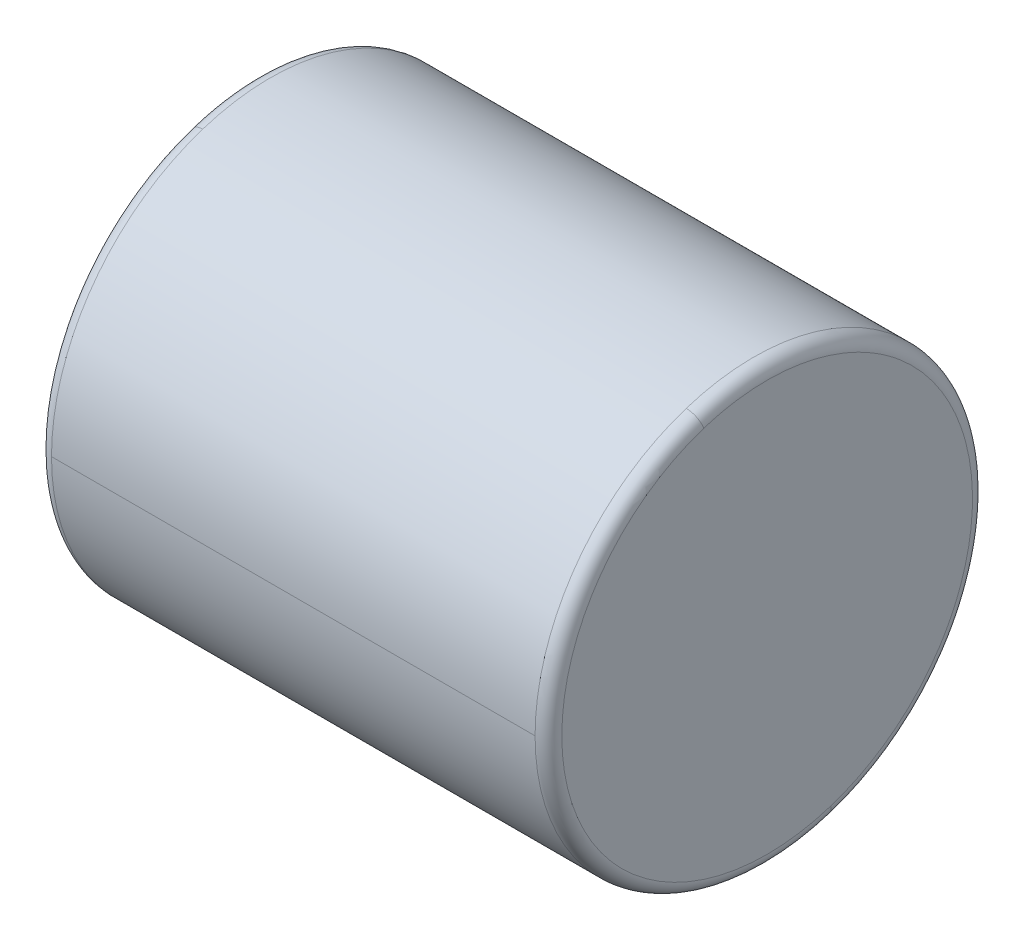
ISO-10303-21;
HEADER;
FILE_DESCRIPTION(('STEP AP214'),'2;1');
FILE_NAME('part.step','',(''),(''),'','','');
FILE_SCHEMA(('AUTOMOTIVE_DESIGN { 1 0 10303 214 1 1 1 1 }'));
ENDSEC;
DATA;
#1=APPLICATION_CONTEXT('core data for automotive mechanical design processes');
#2=APPLICATION_PROTOCOL_DEFINITION('international standard','automotive_design',2000,#1);
#3=PRODUCT_CONTEXT('',#1,'mechanical');
#4=PRODUCT('Part','Part','',(#3));
#5=PRODUCT_RELATED_PRODUCT_CATEGORY('part','',(#4));
#6=PRODUCT_DEFINITION_FORMATION('','',#4);
#7=PRODUCT_DEFINITION_CONTEXT('part definition',#1,'design');
#8=PRODUCT_DEFINITION('design','',#6,#7);
#9=PRODUCT_DEFINITION_SHAPE('','',#8);
#10=(LENGTH_UNIT() NAMED_UNIT(*) SI_UNIT(.MILLI.,.METRE.));
#11=(NAMED_UNIT(*) PLANE_ANGLE_UNIT() SI_UNIT($,.RADIAN.));
#12=(NAMED_UNIT(*) SI_UNIT($,.STERADIAN.) SOLID_ANGLE_UNIT());
#13=UNCERTAINTY_MEASURE_WITH_UNIT(LENGTH_MEASURE(1.E-05),#10,'distance_accuracy_value','');
#14=(GEOMETRIC_REPRESENTATION_CONTEXT(3) GLOBAL_UNCERTAINTY_ASSIGNED_CONTEXT((#13)) GLOBAL_UNIT_ASSIGNED_CONTEXT((#10,
#11,#12)) REPRESENTATION_CONTEXT('',''));
#15=CARTESIAN_POINT('',(0.,0.,0.));
#16=DIRECTION('',(0.,0.,1.));
#17=DIRECTION('',(1.,0.,0.));
#18=AXIS2_PLACEMENT_3D('',#15,#16,#17);
#19=CARTESIAN_POINT('',(3.50000000000372,38.9999999999976,6.12010442324618E-12));
#20=DIRECTION('',(1.,0.,0.));
#21=DIRECTION('',(0.,0.,-1.00000000000001));
#22=AXIS2_PLACEMENT_3D('',#19,#20,#21);
#23=PLANE('',#22);
#24=CARTESIAN_POINT('',(3.50000000000372,44.3576183751267,1.74079573498474));
#25=CARTESIAN_POINT('',(3.50000000000372,44.3291365023257,1.82846025338859));
#26=CARTESIAN_POINT('',(3.50000000000372,44.2984994340093,1.91542433138424));
#27=CARTESIAN_POINT('',(3.50000000000372,44.2329967479176,2.08774515638681));
#28=CARTESIAN_POINT('',(3.50000000000372,44.1981311301424,2.17310190339374));
#29=CARTESIAN_POINT('',(3.50000000000372,44.1242531867054,2.34200161624661));
#30=CARTESIAN_POINT('',(3.50000000000372,44.0852408610436,2.42554458209255));
#31=CARTESIAN_POINT('',(3.50000000000372,44.0031640627719,2.59061568956198));
#32=CARTESIAN_POINT('',(3.50000000000372,43.960099590162,2.67214383118547));
#33=CARTESIAN_POINT('',(3.50000000000372,43.8700220895198,2.83298882302508));
#34=CARTESIAN_POINT('',(3.50000000000372,43.8230090614874,2.91230567324119));
#35=CARTESIAN_POINT('',(3.50000000000372,43.7251477499172,3.06853701676875));
#36=CARTESIAN_POINT('',(3.50000000000372,43.6742994663793,3.14545151008019));
#37=CARTESIAN_POINT('',(3.50000000000372,43.5688901306698,3.29669284182899));
#38=CARTESIAN_POINT('',(3.50000000000372,43.5143290784982,3.37101968026635));
#39=CARTESIAN_POINT('',(3.50000000000372,43.4016256508483,3.51690664353316));
#40=CARTESIAN_POINT('',(3.50000000000372,43.34348327537,3.58846676836261));
#41=CARTESIAN_POINT('',(3.50000000000372,43.2237572703853,3.72864790950212));
#42=CARTESIAN_POINT('',(3.50000000000372,43.1621736408789,3.79726892581218));
#43=CARTESIAN_POINT('',(3.50000000000372,43.035713488409,3.93140653595528));
#44=CARTESIAN_POINT('',(3.50000000000372,42.9708369654455,3.99692312978831));
#45=CARTESIAN_POINT('',(3.50000000000372,42.8379473192305,4.12469405974249));
#46=CARTESIAN_POINT('',(3.50000000000372,42.769934195979,4.18694839586363));
#47=CARTESIAN_POINT('',(3.50000000000372,42.6309351987745,4.3080448342513));
#48=CARTESIAN_POINT('',(3.50000000000372,42.5599493248215,4.36688693651783));
#49=CARTESIAN_POINT('',(3.50000000000372,42.4151758373979,4.48101715141639));
#50=CARTESIAN_POINT('',(3.50000000000372,42.3413882239272,4.53630526404843));
#51=CARTESIAN_POINT('',(3.50000000000372,42.1911890182934,4.64319430577242));
#52=CARTESIAN_POINT('',(3.50000000000372,42.1147774261301,4.69479523486438));
#53=CARTESIAN_POINT('',(3.50000000000372,41.9595143453291,4.79418559835022));
#54=CARTESIAN_POINT('',(3.50000000000372,41.8806628566913,4.8419750327441));
#55=CARTESIAN_POINT('',(3.50000000000372,41.720709943084,4.9336272779005));
#56=CARTESIAN_POINT('',(3.50000000000372,41.6396085181144,4.97749008866302));
#57=CARTESIAN_POINT('',(3.50000000000372,41.4753511122799,5.06118341720363));
#58=CARTESIAN_POINT('',(3.50000000000372,41.392195131415,5.10101393498172));
#59=CARTESIAN_POINT('',(3.50000000000372,41.2240289438312,5.17654672234742));
#60=CARTESIAN_POINT('',(3.50000000000372,41.1390187371124,5.21224899193502));
#61=CARTESIAN_POINT('',(3.50000000000372,40.9673488948549,5.27943927302515));
#62=CARTESIAN_POINT('',(3.50000000000372,40.8806892593162,5.31092728452767));
#63=CARTESIAN_POINT('',(3.50000000000372,40.7059293300714,5.36961319206991));
#64=CARTESIAN_POINT('',(3.50000000000372,40.6178290363654,5.39681108810962));
#65=CARTESIAN_POINT('',(3.50000000000372,40.4404000321101,5.44685124261242));
#66=CARTESIAN_POINT('',(3.50000000000372,40.3510713215609,5.46969350107551));
#67=CARTESIAN_POINT('',(3.50000000000372,40.1714006843072,5.51096735142367));
#68=CARTESIAN_POINT('',(3.50000000000372,40.0810587576028,5.52939894330875));
#69=CARTESIAN_POINT('',(3.50000000000372,39.8995793296533,5.56180705718162));
#70=CARTESIAN_POINT('',(3.50000000000372,39.8084418284082,5.57578357916942));
#71=CARTESIAN_POINT('',(3.50000000000372,39.6255908096004,5.59924788258208));
#72=CARTESIAN_POINT('',(3.50000000000372,39.5338772920377,5.60873566400694));
#73=CARTESIAN_POINT('',(3.50000000000372,39.3500951864918,5.62319962939722));
#74=CARTESIAN_POINT('',(3.50000000000372,39.2580265985086,5.62817581336265));
#75=CARTESIAN_POINT('',(3.50000000000372,39.0737561534143,5.63360459577104));
#76=CARTESIAN_POINT('',(3.50000000000372,38.9815542963033,5.634057194214));
#77=CARTESIAN_POINT('',(3.50000000000372,38.797239435303,5.63043771522818));
#78=CARTESIAN_POINT('',(3.50000000000372,38.7051264314138,5.62636563779938));
#79=CARTESIAN_POINT('',(3.50000000000372,38.5212111851517,5.61370661706124));
#80=CARTESIAN_POINT('',(3.50000000000372,38.4294089427788,5.60511967375189));
#81=CARTESIAN_POINT('',(3.50000000000372,38.2463363791923,5.5834516079512));
#82=CARTESIAN_POINT('',(3.50000000000372,38.1550660579786,5.57037048545985));
#83=CARTESIAN_POINT('',(3.50000000000372,37.9732772149086,5.53974557486501));
#84=CARTESIAN_POINT('',(3.50000000000372,37.8827586930522,5.52220178676152));
#85=CARTESIAN_POINT('',(3.50000000000372,37.7026915157444,5.48269380946459));
#86=CARTESIAN_POINT('',(3.50000000000372,37.613142860293,5.46072962027115));
#87=CARTESIAN_POINT('',(3.50000000000372,37.4352311463497,5.41243375444992));
#88=CARTESIAN_POINT('',(3.50000000000372,37.3468680878577,5.38610207782213));
#89=CARTESIAN_POINT('',(3.50000000000372,37.1715404421809,5.32913467244758));
#90=CARTESIAN_POINT('',(3.50000000000372,37.084575854996,5.29849894370083));
#91=CARTESIAN_POINT('',(3.50000000000372,36.912254657241,5.23299723824227));
#92=CARTESIAN_POINT('',(3.50000000000372,36.8268980466709,5.19813126153047));
#93=CARTESIAN_POINT('',(3.50000000000372,36.6579984336968,5.12425305533362));
#94=CARTESIAN_POINT('',(3.50000000000372,36.5744554312927,5.08524082584857));
#95=CARTESIAN_POINT('',(3.50000000000372,36.4093842970609,5.00316409798313));
#96=CARTESIAN_POINT('',(3.50000000000372,36.3278561652331,4.96009959960273));
#97=CARTESIAN_POINT('',(3.50000000000372,36.1670111805644,4.87002208009519));
#98=CARTESIAN_POINT('',(3.50000000000372,36.0876943277236,4.82300905896805));
#99=CARTESIAN_POINT('',(3.50000000000372,35.9314629822746,4.72514775245277));
#100=CARTESIAN_POINT('',(3.50000000000372,35.8545484896664,4.67429946706463));
#101=CARTESIAN_POINT('',(3.50000000000372,35.7033071584325,4.56889013000064));
#102=CARTESIAN_POINT('',(3.50000000000372,35.6289803198067,4.51432907832478));
#103=CARTESIAN_POINT('',(3.50000000000372,35.4830933564019,4.40162565103784));
#104=CARTESIAN_POINT('',(3.50000000000372,35.4115332316229,4.34348327542674));
#105=CARTESIAN_POINT('',(3.50000000000372,35.2713520905204,4.22375727034483));
#106=CARTESIAN_POINT('',(3.50000000000372,35.2027310741968,4.16217364087401));
#107=CARTESIAN_POINT('',(3.50000000000372,35.0685934640438,4.03571348843013));
#108=CARTESIAN_POINT('',(3.50000000000372,35.0030768702144,3.97083696545707));
#109=CARTESIAN_POINT('',(3.50000000000372,34.8753059402629,3.83794731923507));
#110=CARTESIAN_POINT('',(3.50000000000372,34.8130516041408,3.76993419598612));
#111=CARTESIAN_POINT('',(3.50000000000372,34.6919551657524,3.6309351987835));
#112=CARTESIAN_POINT('',(3.50000000000372,34.6331130634861,3.55994932482982));
#113=CARTESIAN_POINT('',(3.50000000000372,34.5189828485877,3.41517583740571));
#114=CARTESIAN_POINT('',(3.50000000000372,34.4636947359556,3.34138822393528));
#115=CARTESIAN_POINT('',(3.50000000000372,34.3568056942316,3.19118901830156));
#116=CARTESIAN_POINT('',(3.50000000000372,34.3052047651397,3.11477742613826));
#117=CARTESIAN_POINT('',(3.50000000000372,34.2058144016538,2.95951434533718));
#118=CARTESIAN_POINT('',(3.50000000000372,34.1580249672599,2.8806628566994));
#119=CARTESIAN_POINT('',(3.50000000000372,34.0663727221035,2.72070994309206));
#120=CARTESIAN_POINT('',(3.50000000000372,34.022509911341,2.6396085181225));
#121=CARTESIAN_POINT('',(3.50000000000372,33.9388165828004,2.475351112288));
#122=CARTESIAN_POINT('',(3.50000000000372,33.8989860650223,2.39219513142306));
#123=CARTESIAN_POINT('',(3.50000000000372,33.8234532776566,2.2240289438393));
#124=CARTESIAN_POINT('',(3.50000000000372,33.787751008069,2.13901873712048));
#125=CARTESIAN_POINT('',(3.50000000000372,33.7205607269789,1.96734889486299));
#126=CARTESIAN_POINT('',(3.50000000000372,33.6890727154764,1.88068925932431));
#127=CARTESIAN_POINT('',(3.50000000000372,33.6303868079341,1.70592933007952));
#128=CARTESIAN_POINT('',(3.50000000000372,33.6031889118942,1.61782903637341));
#129=CARTESIAN_POINT('',(3.50000000000372,33.5531487573919,1.44040003211826));
#130=CARTESIAN_POINT('',(3.50000000000372,33.5303064989295,1.35107132156923));
#131=CARTESIAN_POINT('',(3.50000000000372,33.4890326485794,1.17140068431508));
#132=CARTESIAN_POINT('',(3.50000000000372,33.4706010566917,1.08105875760996));
#133=CARTESIAN_POINT('',(3.50000000000372,33.438192942826,0.899579329662388));
#134=CARTESIAN_POINT('',(3.50000000000372,33.4242164208481,0.808441828419933));
#135=CARTESIAN_POINT('',(3.50000000000372,33.4007521174085,0.625590809604843));
#136=CARTESIAN_POINT('',(3.50000000000372,33.3912643359469,0.533877292032209));
#137=CARTESIAN_POINT('',(3.50000000000372,33.376800370657,0.350095186513587));
#138=CARTESIAN_POINT('',(3.50000000000372,33.3718241868287,0.2580265985676));
#139=CARTESIAN_POINT('',(3.50000000000372,33.3663954040456,0.0737561533715897));
#140=CARTESIAN_POINT('',(3.50000000000372,33.3659428050908,-0.0184457038784322));
#141=CARTESIAN_POINT('',(3.50000000000372,33.3695622854751,-0.202760564499114));
#142=CARTESIAN_POINT('',(3.50000000000372,33.3736343648141,-0.294873567869774));
#143=CARTESIAN_POINT('',(3.50000000000372,33.3862933803333,-0.478788815548576));
#144=CARTESIAN_POINT('',(3.50000000000372,33.3948803165135,-0.570591059856718));
#145=CARTESIAN_POINT('',(3.50000000000372,33.4165484017915,-0.753663618155931));
#146=CARTESIAN_POINT('',(3.50000000000372,33.4296295508894,-0.844933932147003));
#147=CARTESIAN_POINT('',(3.50000000000372,33.4602543887938,-1.02672279494957));
#148=CARTESIAN_POINT('',(3.50000000000372,33.4777980776003,-1.11724134376107));
#149=CARTESIAN_POINT('',(3.50000000000372,33.5173063261816,-1.29730844742606));
#150=CARTESIAN_POINT('',(3.50000000000372,33.5392708859565,-1.38685700227955));
#151=CARTESIAN_POINT('',(3.50000000000372,33.5875657393305,-1.56476899106155));
#152=CARTESIAN_POINT('',(3.50000000000372,33.6138960329297,-1.65313242499006));
#153=CARTESIAN_POINT('',(3.50000000000372,33.6423816248692,-1.7407957349726));
#154=B_SPLINE_CURVE_WITH_KNOTS('',3,(#24,#25,#26,#27,#28,#29,#30,#31,#32,#33,#34,#35,#36,#37,
#38,#39,#40,#41,#42,#43,#44,#45,#46,#47,#48,#49,#50,#51,#52,#53,#54,#55,#56,#57,#58,#59,#60,#61,
#62,#63,#64,#65,#66,#67,#68,#69,#70,#71,#72,#73,#74,#75,#76,#77,#78,#79,#80,#81,#82,#83,#84,#85,
#86,#87,#88,#89,#90,#91,#92,#93,#94,#95,#96,#97,#98,#99,#100,#101,#102,#103,#104,#105,#106,#107,
#108,#109,#110,#111,#112,#113,#114,#115,#116,#117,#118,#119,#120,#121,#122,#123,#124,#125,#126,
#127,#128,#129,#130,#131,#132,#133,#134,#135,#136,#137,#138,#139,#140,#141,#142,#143,#144,#145,
#146,#147,#148,#149,#150,#151,#152,#153),.UNSPECIFIED.,.F.,.F.,(4,2,2,2,2,2,2,2,2,2,2,2,2,2,2,2,
2,2,2,2,2,2,2,2,2,2,2,2,2,2,2,2,2,2,2,2,2,2,2,2,2,2,2,2,2,2,2,2,2,2,2,2,2,2,2,2,2,2,2,2,2,2,2,2,
4),(0.,0.276497841358115,0.552995682716229,0.829493524074343,1.10599136543246,1.38248920679057,
1.65898704814869,1.9354848895068,2.21198273086492,2.48848057222304,2.76497841358115,
3.04147625493926,3.31797409629738,3.59447193765549,3.87096977901361,4.14746762037172,
4.42396546172984,4.70046330308796,4.97696114444607,5.25345898580418,5.5299568271623,
5.80645466852041,6.08295250987853,6.35945035123665,6.63594819259476,6.91244603395287,
7.18894387531099,7.4654417166691,7.74193955802722,8.01843739938533,8.29493524074345,
8.57143308210156,8.84793092345968,9.12442876481779,9.40092660617591,9.67742444753402,
9.95392228889214,10.2304201302502,10.5069179716084,10.7834158129665,11.0599136543246,
11.3364114956827,11.6129093370408,11.8894071783989,12.1659050197571,12.4424028611152,
12.7189007024733,12.9953985438314,13.2718963851895,13.5483942265476,13.8248920679058,
14.1013899092639,14.377887750622,14.6543855919801,14.9308834333382,15.2073812746963,
15.4838791160544,15.7603769574125,16.0368747987707,16.3133726401288,16.5898704814869,
16.866368322845,17.1428661642031,17.4193640055612,17.6958618469194),.UNSPECIFIED.);
#155=CARTESIAN_POINT('',(3.50000000000367,44.3576183751264,1.7407957349847));
#156=VERTEX_POINT('',#155);
#157=CARTESIAN_POINT('',(3.50000000000367,33.6423816248688,-1.7407957349726));
#158=VERTEX_POINT('',#157);
#159=EDGE_CURVE('E11',#156,#158,#154,.T.);
#160=ORIENTED_EDGE('',*,*,#159,.F.);
#161=CARTESIAN_POINT('',(3.50000000000372,33.6423816248692,-1.74079573497261));
#162=CARTESIAN_POINT('',(3.50000000000372,33.6708634976702,-1.82846025337647));
#163=CARTESIAN_POINT('',(3.50000000000372,33.7015005659867,-1.91542433137211));
#164=CARTESIAN_POINT('',(3.50000000000372,33.7670032520783,-2.08774515637468));
#165=CARTESIAN_POINT('',(3.50000000000372,33.8018688698535,-2.17310190338161));
#166=CARTESIAN_POINT('',(3.50000000000372,33.8757468132905,-2.34200161623448));
#167=CARTESIAN_POINT('',(3.50000000000372,33.9147591389523,-2.42554458208042));
#168=CARTESIAN_POINT('',(3.50000000000372,33.996835937224,-2.59061568954985));
#169=CARTESIAN_POINT('',(3.50000000000372,34.039900409834,-2.67214383117334));
#170=CARTESIAN_POINT('',(3.50000000000372,34.1299779104762,-2.83298882301295));
#171=CARTESIAN_POINT('',(3.50000000000372,34.1769909385085,-2.91230567322906));
#172=CARTESIAN_POINT('',(3.50000000000372,34.2748522500787,-3.06853701675662));
#173=CARTESIAN_POINT('',(3.50000000000372,34.3257005336166,-3.14545151006807));
#174=CARTESIAN_POINT('',(3.50000000000372,34.4311098693262,-3.29669284181686));
#175=CARTESIAN_POINT('',(3.50000000000372,34.4856709214978,-3.37101968025422));
#176=CARTESIAN_POINT('',(3.50000000000372,34.5983743491477,-3.51690664352103));
#177=CARTESIAN_POINT('',(3.50000000000372,34.6565167246259,-3.58846676835048));
#178=CARTESIAN_POINT('',(3.50000000000372,34.7762427296106,-3.72864790948999));
#179=CARTESIAN_POINT('',(3.50000000000372,34.837826359117,-3.79726892580005));
#180=CARTESIAN_POINT('',(3.50000000000372,34.9642865115869,-3.93140653594314));
#181=CARTESIAN_POINT('',(3.50000000000372,35.0291630345505,-3.99692312977618));
#182=CARTESIAN_POINT('',(3.50000000000372,35.1620526807655,-4.12469405973036));
#183=CARTESIAN_POINT('',(3.50000000000372,35.230065804017,-4.1869483958515));
#184=CARTESIAN_POINT('',(3.50000000000372,35.3690648012215,-4.30804483423917));
#185=CARTESIAN_POINT('',(3.50000000000372,35.4400506751745,-4.3668869365057));
#186=CARTESIAN_POINT('',(3.50000000000372,35.5848241625981,-4.48101715140426));
#187=CARTESIAN_POINT('',(3.50000000000372,35.6586117760687,-4.53630526403629));
#188=CARTESIAN_POINT('',(3.50000000000372,35.8088109817025,-4.64319430576029));
#189=CARTESIAN_POINT('',(3.50000000000372,35.8852225738658,-4.69479523485224));
#190=CARTESIAN_POINT('',(3.50000000000372,36.0404856546668,-4.79418559833808));
#191=CARTESIAN_POINT('',(3.50000000000372,36.1193371433046,-4.84197503273196));
#192=CARTESIAN_POINT('',(3.50000000000372,36.279290056912,-4.93362727788837));
#193=CARTESIAN_POINT('',(3.50000000000372,36.3603914818815,-4.97749008865089));
#194=CARTESIAN_POINT('',(3.50000000000372,36.524648887716,-5.0611834171915));
#195=CARTESIAN_POINT('',(3.50000000000372,36.607804868581,-5.1010139349696));
#196=CARTESIAN_POINT('',(3.50000000000372,36.7759710561647,-5.17654672233529));
#197=CARTESIAN_POINT('',(3.50000000000372,36.8609812628836,-5.21224899192289));
#198=CARTESIAN_POINT('',(3.50000000000372,37.0326511051411,-5.27943927301302));
#199=CARTESIAN_POINT('',(3.50000000000372,37.1193107406798,-5.31092728451554));
#200=CARTESIAN_POINT('',(3.50000000000372,37.2940706699245,-5.36961319205778));
#201=CARTESIAN_POINT('',(3.50000000000372,37.3821709636306,-5.39681108809749));
#202=CARTESIAN_POINT('',(3.50000000000372,37.5595999678858,-5.44685124260029));
#203=CARTESIAN_POINT('',(3.50000000000372,37.6489286784351,-5.46969350106338));
#204=CARTESIAN_POINT('',(3.50000000000372,37.8285993156887,-5.51096735141154));
#205=CARTESIAN_POINT('',(3.50000000000372,37.9189412423931,-5.52939894329662));
#206=CARTESIAN_POINT('',(3.50000000000372,38.1004206703426,-5.56180705716949));
#207=CARTESIAN_POINT('',(3.50000000000372,38.1915581715878,-5.5757835791573));
#208=CARTESIAN_POINT('',(3.50000000000372,38.3744091903955,-5.59924788256995));
#209=CARTESIAN_POINT('',(3.50000000000372,38.4661227079582,-5.60873566399481));
#210=CARTESIAN_POINT('',(3.50000000000372,38.6499048135041,-5.62319962938509));
#211=CARTESIAN_POINT('',(3.50000000000372,38.7419734014873,-5.62817581335052));
#212=CARTESIAN_POINT('',(3.50000000000372,38.9262438465816,-5.63360459575891));
#213=CARTESIAN_POINT('',(3.50000000000372,39.0184457036927,-5.63405719420187));
#214=CARTESIAN_POINT('',(3.50000000000372,39.202760564693,-5.63043771521604));
#215=CARTESIAN_POINT('',(3.50000000000372,39.2948735685822,-5.62636563778725));
#216=CARTESIAN_POINT('',(3.50000000000372,39.4787888148443,-5.61370661704911));
#217=CARTESIAN_POINT('',(3.50000000000372,39.5705910572171,-5.60511967373976));
#218=CARTESIAN_POINT('',(3.50000000000372,39.7536636208036,-5.58345160793907));
#219=CARTESIAN_POINT('',(3.50000000000372,39.8449339420173,-5.57037048544772));
#220=CARTESIAN_POINT('',(3.50000000000372,40.0267227850874,-5.53974557485288));
#221=CARTESIAN_POINT('',(3.50000000000372,40.1172413069437,-5.52220178674939));
#222=CARTESIAN_POINT('',(3.50000000000372,40.2973084842515,-5.48269380945246));
#223=CARTESIAN_POINT('',(3.50000000000372,40.3868571397029,-5.46072962025902));
#224=CARTESIAN_POINT('',(3.50000000000372,40.5647688536463,-5.41243375443779));
#225=CARTESIAN_POINT('',(3.50000000000372,40.6531319121382,-5.38610207781));
#226=CARTESIAN_POINT('',(3.50000000000372,40.8284595578151,-5.32913467243545));
#227=CARTESIAN_POINT('',(3.50000000000372,40.9154241449999,-5.2984989436887));
#228=CARTESIAN_POINT('',(3.50000000000372,41.0877453427549,-5.23299723823014));
#229=CARTESIAN_POINT('',(3.50000000000372,41.173101953325,-5.19813126151834));
#230=CARTESIAN_POINT('',(3.50000000000372,41.3420015662992,-5.12425305532149));
#231=CARTESIAN_POINT('',(3.50000000000372,41.4255445687032,-5.08524082583645));
#232=CARTESIAN_POINT('',(3.50000000000372,41.5906157029351,-5.003164097971));
#233=CARTESIAN_POINT('',(3.50000000000372,41.6721438347628,-4.96009959959061));
#234=CARTESIAN_POINT('',(3.50000000000372,41.8329888194315,-4.87002208008307));
#235=CARTESIAN_POINT('',(3.50000000000372,41.9123056722724,-4.82300905895593));
#236=CARTESIAN_POINT('',(3.50000000000372,42.0685370177214,-4.72514775244064));
#237=CARTESIAN_POINT('',(3.50000000000372,42.1454515103295,-4.6742994670525));
#238=CARTESIAN_POINT('',(3.50000000000372,42.2966928415635,-4.56889012998851));
#239=CARTESIAN_POINT('',(3.50000000000372,42.3710196801893,-4.51432907831266));
#240=CARTESIAN_POINT('',(3.50000000000372,42.516906643594,-4.40162565102571));
#241=CARTESIAN_POINT('',(3.50000000000372,42.588466768373,-4.34348327541462));
#242=CARTESIAN_POINT('',(3.50000000000372,42.7286479094755,-4.2237572703327));
#243=CARTESIAN_POINT('',(3.50000000000372,42.7972689257991,-4.16217364086189));
#244=CARTESIAN_POINT('',(3.50000000000372,42.9314065359521,-4.03571348841801));
#245=CARTESIAN_POINT('',(3.50000000000372,42.9969231297815,-3.97083696544495));
#246=CARTESIAN_POINT('',(3.50000000000372,43.1246940597331,-3.83794731922294));
#247=CARTESIAN_POINT('',(3.50000000000372,43.1869483958552,-3.769934195974));
#248=CARTESIAN_POINT('',(3.50000000000372,43.3080448342435,-3.63093519877137));
#249=CARTESIAN_POINT('',(3.50000000000372,43.3668869365098,-3.5599493248177));
#250=CARTESIAN_POINT('',(3.50000000000372,43.4810171514082,-3.41517583739359));
#251=CARTESIAN_POINT('',(3.50000000000372,43.5363052640403,-3.34138822392316));
#252=CARTESIAN_POINT('',(3.50000000000372,43.6431943057643,-3.19118901828943));
#253=CARTESIAN_POINT('',(3.50000000000372,43.6947952348563,-3.11477742612614));
#254=CARTESIAN_POINT('',(3.50000000000372,43.7941855983421,-2.95951434532506));
#255=CARTESIAN_POINT('',(3.50000000000372,43.841975032736,-2.88066285668728));
#256=CARTESIAN_POINT('',(3.50000000000372,43.9336272778924,-2.72070994307994));
#257=CARTESIAN_POINT('',(3.50000000000372,43.9774900886549,-2.63960851811038));
#258=CARTESIAN_POINT('',(3.50000000000372,44.0611834171955,-2.47535111227588));
#259=CARTESIAN_POINT('',(3.50000000000372,44.1010139349736,-2.39219513141094));
#260=CARTESIAN_POINT('',(3.50000000000372,44.1765467223393,-2.22402894382718));
#261=CARTESIAN_POINT('',(3.50000000000372,44.2122489919269,-2.13901873710836));
#262=CARTESIAN_POINT('',(3.50000000000372,44.279439273017,-1.96734889485087));
#263=CARTESIAN_POINT('',(3.50000000000372,44.3109272845195,-1.88068925931219));
#264=CARTESIAN_POINT('',(3.50000000000372,44.3696131920619,-1.7059293300674));
#265=CARTESIAN_POINT('',(3.50000000000372,44.3968110881018,-1.61782903636129));
#266=CARTESIAN_POINT('',(3.50000000000372,44.4468512426041,-1.44040003210614));
#267=CARTESIAN_POINT('',(3.50000000000372,44.4696935010664,-1.35107132155711));
#268=CARTESIAN_POINT('',(3.50000000000372,44.5109673514165,-1.17140068430296));
#269=CARTESIAN_POINT('',(3.50000000000372,44.5293989433043,-1.08105875759784));
#270=CARTESIAN_POINT('',(3.50000000000372,44.5618070571699,-0.899579329650267));
#271=CARTESIAN_POINT('',(3.50000000000372,44.5757835791479,-0.80844182840781));
#272=CARTESIAN_POINT('',(3.50000000000372,44.5992478825874,-0.625590809592721));
#273=CARTESIAN_POINT('',(3.50000000000372,44.608735664049,-0.533877292020089));
#274=CARTESIAN_POINT('',(3.50000000000372,44.6231996293389,-0.350095186501468));
#275=CARTESIAN_POINT('',(3.50000000000372,44.6281758131672,-0.25802659855548));
#276=CARTESIAN_POINT('',(3.50000000000372,44.6336045959503,-0.0737561533594707));
#277=CARTESIAN_POINT('',(3.50000000000372,44.6340571949051,0.0184457038905512));
#278=CARTESIAN_POINT('',(3.50000000000372,44.6304377145209,0.202760564511233));
#279=CARTESIAN_POINT('',(3.50000000000372,44.6263656351818,0.294873567881893));
#280=CARTESIAN_POINT('',(3.50000000000372,44.6137066196626,0.478788815560695));
#281=CARTESIAN_POINT('',(3.50000000000372,44.6051196834825,0.570591059868837));
#282=CARTESIAN_POINT('',(3.50000000000372,44.5834515982044,0.753663618168052));
#283=CARTESIAN_POINT('',(3.50000000000372,44.5703704491065,0.844933932159125));
#284=CARTESIAN_POINT('',(3.50000000000372,44.5397456112021,1.0267227949617));
#285=CARTESIAN_POINT('',(3.50000000000372,44.5222019223956,1.11724134377319));
#286=CARTESIAN_POINT('',(3.50000000000372,44.4826936738143,1.29730844743818));
#287=CARTESIAN_POINT('',(3.50000000000372,44.4607291140395,1.38685700229167));
#288=CARTESIAN_POINT('',(3.50000000000372,44.4124342606654,1.56476899107367));
#289=CARTESIAN_POINT('',(3.50000000000372,44.3861039670662,1.65313242500218));
#290=CARTESIAN_POINT('',(3.50000000000372,44.3576183751268,1.74079573498471));
#291=B_SPLINE_CURVE_WITH_KNOTS('',3,(#161,#162,#163,#164,#165,#166,#167,#168,#169,#170,#171,
#172,#173,#174,#175,#176,#177,#178,#179,#180,#181,#182,#183,#184,#185,#186,#187,#188,#189,#190,
#191,#192,#193,#194,#195,#196,#197,#198,#199,#200,#201,#202,#203,#204,#205,#206,#207,#208,#209,
#210,#211,#212,#213,#214,#215,#216,#217,#218,#219,#220,#221,#222,#223,#224,#225,#226,#227,#228,
#229,#230,#231,#232,#233,#234,#235,#236,#237,#238,#239,#240,#241,#242,#243,#244,#245,#246,#247,
#248,#249,#250,#251,#252,#253,#254,#255,#256,#257,#258,#259,#260,#261,#262,#263,#264,#265,#266,
#267,#268,#269,#270,#271,#272,#273,#274,#275,#276,#277,#278,#279,#280,#281,#282,#283,#284,#285,
#286,#287,#288,#289,#290),.UNSPECIFIED.,.F.,.F.,(4,2,2,2,2,2,2,2,2,2,2,2,2,2,2,2,2,2,2,2,2,2,2,
2,2,2,2,2,2,2,2,2,2,2,2,2,2,2,2,2,2,2,2,2,2,2,2,2,2,2,2,2,2,2,2,2,2,2,2,2,2,2,2,2,4),(0.,
0.276497841358115,0.552995682716228,0.829493524074342,1.10599136543246,1.38248920679057,
1.65898704814869,1.9354848895068,2.21198273086492,2.48848057222303,2.76497841358115,
3.04147625493926,3.31797409629738,3.59447193765549,3.87096977901361,4.14746762037172,
4.42396546172983,4.70046330308795,4.97696114444607,5.25345898580418,5.5299568271623,
5.80645466852041,6.08295250987852,6.35945035123664,6.63594819259475,6.91244603395286,
7.18894387531098,7.46544171666909,7.74193955802721,8.01843739938533,8.29493524074344,
8.57143308210155,8.84793092345967,9.12442876481779,9.4009266061759,9.67742444753402,
9.95392228889213,10.2304201302502,10.5069179716084,10.7834158129665,11.0599136543246,
11.3364114956827,11.6129093370408,11.8894071783989,12.165905019757,12.4424028611152,
12.7189007024733,12.9953985438314,13.2718963851895,13.5483942265476,13.8248920679057,
14.1013899092639,14.377887750622,14.6543855919801,14.9308834333382,15.2073812746963,
15.4838791160544,15.7603769574125,16.0368747987707,16.3133726401288,16.5898704814869,
16.866368322845,17.1428661642031,17.4193640055612,17.6958618469193),.UNSPECIFIED.);
#292=EDGE_CURVE('E27',#158,#156,#291,.T.);
#293=ORIENTED_EDGE('',*,*,#292,.F.);
#294=EDGE_LOOP('',(#160,#293));
#295=FACE_BOUND('',#294,.T.);
#296=ADVANCED_FACE('F17',(#295),#23,.F.);
#297=CARTESIAN_POINT('',(3.86666666667107,38.999999999998,6.06459327201492E-12));
#298=DIRECTION('',(1.,0.,0.));
#299=DIRECTION('',(0.,-0.309016994374951,0.951056516295165));
#300=AXIS2_PLACEMENT_3D('',#297,#298,#299);
#301=TOROIDAL_SURFACE('',#300,5.63333333333266,0.366666666667348);
#302=CARTESIAN_POINT('',(3.86666666667102,33.6423816248693,-1.74079573497271));
#303=DIRECTION('',(0.,0.309016994374949,-0.951056516295166));
#304=DIRECTION('',(-1.77554940446994E-12,-0.951056516295166,-0.309016994374949));
#305=AXIS2_PLACEMENT_3D('',#302,#303,#304);
#306=CIRCLE('',#305,0.366666666667349);
#307=CARTESIAN_POINT('',(3.86666666667037,33.2936609022268,-1.85410196624387));
#308=VERTEX_POINT('',#307);
#309=EDGE_CURVE('E155',#308,#158,#306,.T.);
#310=ORIENTED_EDGE('',*,*,#309,.T.);
#311=ORIENTED_EDGE('',*,*,#292,.T.);
#312=CARTESIAN_POINT('',(3.86666666667101,44.3576183751265,1.74079573498463));
#313=DIRECTION('',(0.,-0.309016994374949,0.951056516295166));
#314=DIRECTION('',(-1.77554940446995E-12,0.951056516295166,0.309016994374949));
#315=AXIS2_PLACEMENT_3D('',#312,#313,#314);
#316=CIRCLE('',#315,0.366666666667349);
#317=CARTESIAN_POINT('',(3.86666666667036,44.7063390977691,1.85410196625575));
#318=VERTEX_POINT('',#317);
#319=EDGE_CURVE('E150',#318,#156,#316,.T.);
#320=ORIENTED_EDGE('',*,*,#319,.F.);
#321=CARTESIAN_POINT('',(3.86666666667042,38.999999999998,6.06459327201492E-12));
#322=DIRECTION('',(1.,0.,0.));
#323=DIRECTION('',(0.,0.,-1.00000000000001));
#324=AXIS2_PLACEMENT_3D('',#321,#322,#323);
#325=CIRCLE('',#324,6.);
#326=CARTESIAN_POINT('',(3.86666666667037,38.9999999999979,-5.99999999999429));
#327=VERTEX_POINT('',#326);
#328=EDGE_CURVE('E144',#327,#318,#325,.T.);
#329=ORIENTED_EDGE('',*,*,#328,.F.);
#330=CARTESIAN_POINT('',(3.86666666667042,38.999999999998,6.06459327201492E-12));
#331=DIRECTION('',(1.,0.,0.));
#332=DIRECTION('',(0.,0.,-1.00000000000001));
#333=AXIS2_PLACEMENT_3D('',#330,#331,#332);
#334=CIRCLE('',#333,6.);
#335=EDGE_CURVE('E138',#308,#327,#334,.T.);
#336=ORIENTED_EDGE('',*,*,#335,.F.);
#337=EDGE_LOOP('',(#310,#311,#320,#329,#336));
#338=FACE_BOUND('',#337,.T.);
#339=ADVANCED_FACE('F162',(#338),#301,.T.);
#340=CARTESIAN_POINT('',(17.5000000000037,38.9999999999975,6.24500451351651E-12));
#341=DIRECTION('',(1.,0.,0.));
#342=DIRECTION('',(0.,1.00000000000001,0.));
#343=AXIS2_PLACEMENT_3D('',#340,#341,#342);
#344=CYLINDRICAL_SURFACE('',#343,6.);
#345=DIRECTION('',(1.,0.,0.));
#346=VECTOR('',#345,1.);
#347=CARTESIAN_POINT('',(3.86666666667037,38.9999999999978,6.00000000000604));
#348=LINE('',#347,#346);
#349=CARTESIAN_POINT('',(3.86666666667037,38.9999999999978,6.00000000000604));
#350=VERTEX_POINT('',#349);
#351=CARTESIAN_POINT('',(17.1333333333367,38.9999999999976,6.00000000000607));
#352=VERTEX_POINT('',#351);
#353=EDGE_CURVE('E95',#350,#352,#348,.T.);
#354=ORIENTED_EDGE('',*,*,#353,.F.);
#355=CARTESIAN_POINT('',(3.86666666667042,38.999999999998,6.06459327201492E-12));
#356=DIRECTION('',(1.,0.,0.));
#357=DIRECTION('',(0.,0.,-1.00000000000001));
#358=AXIS2_PLACEMENT_3D('',#355,#356,#357);
#359=CIRCLE('',#358,6.);
#360=EDGE_CURVE('E128',#350,#308,#359,.T.);
#361=ORIENTED_EDGE('',*,*,#360,.T.);
#362=ORIENTED_EDGE('',*,*,#335,.T.);
#363=DIRECTION('',(1.,0.,0.));
#364=VECTOR('',#363,1.);
#365=CARTESIAN_POINT('',(3.86666666667037,38.9999999999979,-5.99999999999429));
#366=LINE('',#365,#364);
#367=CARTESIAN_POINT('',(17.1333333333369,38.9999999999974,-5.99999999999412));
#368=VERTEX_POINT('',#367);
#369=EDGE_CURVE('E123',#327,#368,#366,.T.);
#370=ORIENTED_EDGE('',*,*,#369,.T.);
#371=CARTESIAN_POINT('',(17.1333333333367,38.9999999999975,6.12010442324618E-12));
#372=DIRECTION('',(1.,0.,0.));
#373=DIRECTION('',(0.,0.,-1.00000000000001));
#374=AXIS2_PLACEMENT_3D('',#371,#372,#373);
#375=CIRCLE('',#374,6.);
#376=CARTESIAN_POINT('',(17.1333333333367,33.2936609022267,-1.85410196624376));
#377=VERTEX_POINT('',#376);
#378=EDGE_CURVE('E86',#377,#368,#375,.T.);
#379=ORIENTED_EDGE('',*,*,#378,.F.);
#380=CARTESIAN_POINT('',(17.1333333333367,38.9999999999975,6.12010442324618E-12));
#381=DIRECTION('',(1.,0.,0.));
#382=DIRECTION('',(0.,0.,-1.00000000000001));
#383=AXIS2_PLACEMENT_3D('',#380,#381,#382);
#384=CIRCLE('',#383,6.);
#385=EDGE_CURVE('E114',#352,#377,#384,.T.);
#386=ORIENTED_EDGE('',*,*,#385,.F.);
#387=EDGE_LOOP('',(#354,#361,#362,#370,#379,#386));
#388=FACE_BOUND('',#387,.T.);
#389=ADVANCED_FACE('F171',(#388),#344,.T.);
#390=CARTESIAN_POINT('',(17.1333333333356,38.9999999999975,6.12010442324618E-12));
#391=DIRECTION('',(1.,0.,0.));
#392=DIRECTION('',(0.,0.309016994374951,-0.951056516295165));
#393=AXIS2_PLACEMENT_3D('',#390,#391,#392);
#394=TOROIDAL_SURFACE('',#393,5.63333333333197,0.366666666668028);
#395=CARTESIAN_POINT('',(17.1333333333356,33.6423816248694,-1.74079573497228));
#396=DIRECTION('',(0.,0.309016994374951,-0.951056516295165));
#397=DIRECTION('',(1.,0.,0.));
#398=AXIS2_PLACEMENT_3D('',#395,#396,#397);
#399=CIRCLE('',#398,0.366666666668028);
#400=CARTESIAN_POINT('',(17.5000000000036,33.6423816248694,-1.74079573497228));
#401=VERTEX_POINT('',#400);
#402=EDGE_CURVE('E109',#401,#377,#399,.T.);
#403=ORIENTED_EDGE('',*,*,#402,.F.);
#404=CARTESIAN_POINT('',(17.5000000000037,38.9999999999975,6.24500451351651E-12));
#405=DIRECTION('',(1.,0.,0.));
#406=DIRECTION('',(0.,0.,-1.00000000000001));
#407=AXIS2_PLACEMENT_3D('',#404,#405,#406);
#408=CIRCLE('',#407,5.633333333333);
#409=CARTESIAN_POINT('',(17.5000000000036,44.3576183751257,1.74079573498438));
#410=VERTEX_POINT('',#409);
#411=EDGE_CURVE('E75',#410,#401,#408,.T.);
#412=ORIENTED_EDGE('',*,*,#411,.F.);
#413=CARTESIAN_POINT('',(17.1333333333356,44.3576183751257,1.74079573498438));
#414=DIRECTION('',(0.,-0.309016994374951,0.951056516295165));
#415=DIRECTION('',(1.,0.,0.));
#416=AXIS2_PLACEMENT_3D('',#413,#414,#415);
#417=CIRCLE('',#416,0.366666666668028);
#418=CARTESIAN_POINT('',(17.1333333333367,44.7063390977687,1.85410196625566));
#419=VERTEX_POINT('',#418);
#420=EDGE_CURVE('E68',#410,#419,#417,.T.);
#421=ORIENTED_EDGE('',*,*,#420,.T.);
#422=CARTESIAN_POINT('',(17.1333333333367,38.9999999999975,6.12010442324618E-12));
#423=DIRECTION('',(1.,0.,0.));
#424=DIRECTION('',(0.,0.,-1.00000000000001));
#425=AXIS2_PLACEMENT_3D('',#422,#423,#424);
#426=CIRCLE('',#425,6.);
#427=EDGE_CURVE('E73',#419,#352,#426,.T.);
#428=ORIENTED_EDGE('',*,*,#427,.T.);
#429=ORIENTED_EDGE('',*,*,#385,.T.);
#430=EDGE_LOOP('',(#403,#412,#421,#428,#429));
#431=FACE_BOUND('',#430,.T.);
#432=ADVANCED_FACE('F70',(#431),#394,.T.);
#433=CARTESIAN_POINT('',(17.5000000000037,38.9999999999975,6.24500451351651E-12));
#434=DIRECTION('',(1.,0.,0.));
#435=DIRECTION('',(0.,-1.00000000000001,0.));
#436=AXIS2_PLACEMENT_3D('',#433,#434,#435);
#437=CYLINDRICAL_SURFACE('',#436,6.);
#438=ORIENTED_EDGE('',*,*,#353,.T.);
#439=ORIENTED_EDGE('',*,*,#427,.F.);
#440=CARTESIAN_POINT('',(17.1333333333367,38.9999999999975,6.12010442324618E-12));
#441=DIRECTION('',(1.,0.,0.));
#442=DIRECTION('',(0.,0.,-1.00000000000001));
#443=AXIS2_PLACEMENT_3D('',#440,#441,#442);
#444=CIRCLE('',#443,6.);
#445=EDGE_CURVE('E83',#368,#419,#444,.T.);
#446=ORIENTED_EDGE('',*,*,#445,.F.);
#447=ORIENTED_EDGE('',*,*,#369,.F.);
#448=ORIENTED_EDGE('',*,*,#328,.T.);
#449=CARTESIAN_POINT('',(3.86666666667042,38.999999999998,6.06459327201492E-12));
#450=DIRECTION('',(1.,0.,0.));
#451=DIRECTION('',(0.,0.,-1.00000000000001));
#452=AXIS2_PLACEMENT_3D('',#449,#450,#451);
#453=CIRCLE('',#452,6.);
#454=EDGE_CURVE('E90',#318,#350,#453,.T.);
#455=ORIENTED_EDGE('',*,*,#454,.T.);
#456=EDGE_LOOP('',(#438,#439,#446,#447,#448,#455));
#457=FACE_BOUND('',#456,.T.);
#458=ADVANCED_FACE('F93',(#457),#437,.T.);
#459=CARTESIAN_POINT('',(3.86666666667107,38.999999999998,6.06459327201492E-12));
#460=DIRECTION('',(1.,0.,0.));
#461=DIRECTION('',(0.,0.309016994374951,-0.951056516295165));
#462=AXIS2_PLACEMENT_3D('',#459,#460,#461);
#463=TOROIDAL_SURFACE('',#462,5.63333333333266,0.366666666667348);
#464=ORIENTED_EDGE('',*,*,#309,.F.);
#465=ORIENTED_EDGE('',*,*,#360,.F.);
#466=ORIENTED_EDGE('',*,*,#454,.F.);
#467=ORIENTED_EDGE('',*,*,#319,.T.);
#468=ORIENTED_EDGE('',*,*,#159,.T.);
#469=EDGE_LOOP('',(#464,#465,#466,#467,#468));
#470=FACE_BOUND('',#469,.T.);
#471=ADVANCED_FACE('F180',(#470),#463,.T.);
#472=CARTESIAN_POINT('',(17.1333333333356,38.9999999999975,6.12010442324618E-12));
#473=DIRECTION('',(1.,0.,0.));
#474=DIRECTION('',(0.,-0.309016994374951,0.951056516295165));
#475=AXIS2_PLACEMENT_3D('',#472,#473,#474);
#476=TOROIDAL_SURFACE('',#475,5.63333333333197,0.366666666668028);
#477=ORIENTED_EDGE('',*,*,#402,.T.);
#478=ORIENTED_EDGE('',*,*,#378,.T.);
#479=ORIENTED_EDGE('',*,*,#445,.T.);
#480=ORIENTED_EDGE('',*,*,#420,.F.);
#481=CARTESIAN_POINT('',(17.5000000000037,33.6423816248684,-1.74079573497295));
#482=CARTESIAN_POINT('',(17.5000000000037,34.1897813390261,-3.42319272096065));
#483=CARTESIAN_POINT('',(17.5000000000037,35.3949058948405,-4.89543726658588));
#484=CARTESIAN_POINT('',(17.5000000000037,37.1595550833614,-5.7922813189225));
#485=CARTESIAN_POINT('',(17.5000000000037,40.9550295526908,-6.01696226900913));
#486=CARTESIAN_POINT('',(17.5000000000037,43.8935687511625,-3.60426764355234));
#487=CARTESIAN_POINT('',(17.5000000000037,44.7940482262162,-1.84147079542543));
#488=CARTESIAN_POINT('',(17.5000000000037,44.903650840522,0.0579545029444022));
#489=CARTESIAN_POINT('',(17.5000000000037,44.3576183751267,1.74079573498463));
#490=B_SPLINE_CURVE_WITH_KNOTS('',5,(#481,#482,#483,#484,#485,#486,#487,#488,#489),
.UNSPECIFIED.,.F.,.F.,(6,3,6),(0.,1.5707963267949,3.14159265358979),.UNSPECIFIED.);
#491=EDGE_CURVE('E202',#401,#410,#490,.T.);
#492=ORIENTED_EDGE('',*,*,#491,.F.);
#493=EDGE_LOOP('',(#477,#478,#479,#480,#492));
#494=FACE_BOUND('',#493,.T.);
#495=ADVANCED_FACE('F85',(#494),#476,.T.);
#496=CARTESIAN_POINT('',(17.5000000000037,44.6333333333306,5.84254866708989E-12));
#497=DIRECTION('',(-1.,0.,0.));
#498=DIRECTION('',(0.,0.,1.00000000000001));
#499=AXIS2_PLACEMENT_3D('',#496,#497,#498);
#500=PLANE('',#499);
#501=ORIENTED_EDGE('',*,*,#491,.T.);
#502=ORIENTED_EDGE('',*,*,#411,.T.);
#503=EDGE_LOOP('',(#501,#502));
#504=FACE_BOUND('',#503,.T.);
#505=ADVANCED_FACE('F211',(#504),#500,.F.);
#506=CLOSED_SHELL('',(#296,#339,#389,#432,#458,#471,#495,#505));
#507=MANIFOLD_SOLID_BREP('B1',#506);
#508=ADVANCED_BREP_SHAPE_REPRESENTATION('',(#18,#507),#14);
#509=SHAPE_DEFINITION_REPRESENTATION(#9,#508);
ENDSEC;
END-ISO-10303-21;
